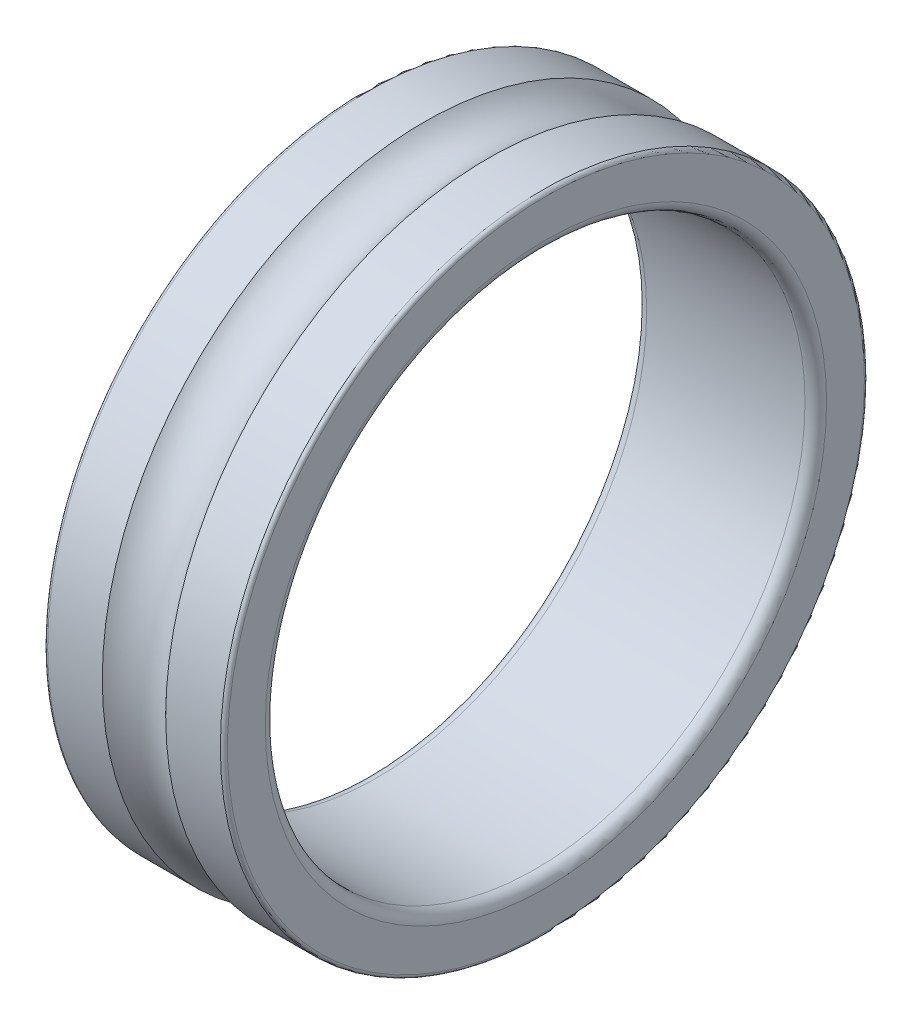
ISO-10303-21;
HEADER;
FILE_DESCRIPTION(('STEP AP214'),'2;1');
FILE_NAME('part.step','',(''),(''),'','','');
FILE_SCHEMA(('AUTOMOTIVE_DESIGN { 1 0 10303 214 1 1 1 1 }'));
ENDSEC;
DATA;
#1=APPLICATION_CONTEXT('core data for automotive mechanical design processes');
#2=APPLICATION_PROTOCOL_DEFINITION('international standard','automotive_design',2000,#1);
#3=PRODUCT_CONTEXT('',#1,'mechanical');
#4=PRODUCT('Part','Part','',(#3));
#5=PRODUCT_RELATED_PRODUCT_CATEGORY('part','',(#4));
#6=PRODUCT_DEFINITION_FORMATION('','',#4);
#7=PRODUCT_DEFINITION_CONTEXT('part definition',#1,'design');
#8=PRODUCT_DEFINITION('design','',#6,#7);
#9=PRODUCT_DEFINITION_SHAPE('','',#8);
#10=(LENGTH_UNIT() NAMED_UNIT(*) SI_UNIT(.MILLI.,.METRE.));
#11=(NAMED_UNIT(*) PLANE_ANGLE_UNIT() SI_UNIT($,.RADIAN.));
#12=(NAMED_UNIT(*) SI_UNIT($,.STERADIAN.) SOLID_ANGLE_UNIT());
#13=UNCERTAINTY_MEASURE_WITH_UNIT(LENGTH_MEASURE(1.E-05),#10,'distance_accuracy_value','');
#14=(GEOMETRIC_REPRESENTATION_CONTEXT(3) GLOBAL_UNCERTAINTY_ASSIGNED_CONTEXT((#13)) GLOBAL_UNIT_ASSIGNED_CONTEXT((#10,
#11,#12)) REPRESENTATION_CONTEXT('',''));
#15=CARTESIAN_POINT('',(0.,0.,0.));
#16=DIRECTION('',(0.,0.,1.));
#17=DIRECTION('',(1.,0.,0.));
#18=AXIS2_PLACEMENT_3D('',#15,#16,#17);
#19=CARTESIAN_POINT('',(0.299999999999941,0.,0.));
#20=DIRECTION('',(1.,0.,0.));
#21=DIRECTION('',(0.,0.,-1.));
#22=AXIS2_PLACEMENT_3D('',#19,#20,#21);
#23=TOROIDAL_SURFACE('',#22,7.79999999999994,0.299999999999941);
#24=CARTESIAN_POINT('',(0.3,0.,0.));
#25=DIRECTION('',(1.,0.,0.));
#26=DIRECTION('',(0.,0.,-1.));
#27=AXIS2_PLACEMENT_3D('',#24,#25,#26);
#28=CIRCLE('',#27,7.5);
#29=CARTESIAN_POINT('',(0.3,0.,-7.5));
#30=VERTEX_POINT('',#29);
#31=EDGE_CURVE('E10',#30,#30,#28,.T.);
#32=ORIENTED_EDGE('',*,*,#31,.T.);
#33=EDGE_LOOP('',(#32));
#34=FACE_BOUND('',#33,.T.);
#35=CARTESIAN_POINT('',(0.,0.,0.));
#36=DIRECTION('',(1.,0.,0.));
#37=DIRECTION('',(0.,0.,-1.));
#38=AXIS2_PLACEMENT_3D('',#35,#36,#37);
#39=CIRCLE('',#38,7.8);
#40=CARTESIAN_POINT('',(0.,0.,-7.8));
#41=VERTEX_POINT('',#40);
#42=EDGE_CURVE('E69',#41,#41,#39,.T.);
#43=ORIENTED_EDGE('',*,*,#42,.F.);
#44=EDGE_LOOP('',(#43));
#45=FACE_BOUND('',#44,.T.);
#46=ADVANCED_FACE('F35',(#34,#45),#23,.T.);
#47=CARTESIAN_POINT('',(4.7,0.,0.));
#48=DIRECTION('',(1.,0.,0.));
#49=DIRECTION('',(0.,0.,-1.));
#50=AXIS2_PLACEMENT_3D('',#47,#48,#49);
#51=CYLINDRICAL_SURFACE('',#50,7.5);
#52=CARTESIAN_POINT('',(4.7,0.,0.));
#53=DIRECTION('',(1.,0.,0.));
#54=DIRECTION('',(0.,0.,-1.));
#55=AXIS2_PLACEMENT_3D('',#52,#53,#54);
#56=CIRCLE('',#55,7.5);
#57=CARTESIAN_POINT('',(4.7,0.,-7.5));
#58=VERTEX_POINT('',#57);
#59=EDGE_CURVE('E41',#58,#58,#56,.T.);
#60=ORIENTED_EDGE('',*,*,#59,.T.);
#61=EDGE_LOOP('',(#60));
#62=FACE_BOUND('',#61,.T.);
#63=ORIENTED_EDGE('',*,*,#31,.F.);
#64=EDGE_LOOP('',(#63));
#65=FACE_BOUND('',#64,.T.);
#66=ADVANCED_FACE('F77',(#62,#65),#51,.F.);
#67=CARTESIAN_POINT('',(4.70000000000012,0.,0.));
#68=DIRECTION('',(1.,0.,0.));
#69=DIRECTION('',(0.,0.,-1.));
#70=AXIS2_PLACEMENT_3D('',#67,#68,#69);
#71=TOROIDAL_SURFACE('',#70,7.79999999999988,0.29999999999988);
#72=CARTESIAN_POINT('',(5.,0.,0.));
#73=DIRECTION('',(1.,0.,0.));
#74=DIRECTION('',(0.,0.,-1.));
#75=AXIS2_PLACEMENT_3D('',#72,#73,#74);
#76=CIRCLE('',#75,7.8);
#77=CARTESIAN_POINT('',(5.,0.,-7.8));
#78=VERTEX_POINT('',#77);
#79=EDGE_CURVE('E45',#78,#78,#76,.T.);
#80=ORIENTED_EDGE('',*,*,#79,.T.);
#81=EDGE_LOOP('',(#80));
#82=FACE_BOUND('',#81,.T.);
#83=ORIENTED_EDGE('',*,*,#59,.F.);
#84=EDGE_LOOP('',(#83));
#85=FACE_BOUND('',#84,.T.);
#86=ADVANCED_FACE('F81',(#82,#85),#71,.T.);
#87=CARTESIAN_POINT('',(5.,7.8,0.));
#88=DIRECTION('',(1.,0.,0.));
#89=DIRECTION('',(0.,0.,-1.));
#90=AXIS2_PLACEMENT_3D('',#87,#88,#89);
#91=PLANE('',#90);
#92=CARTESIAN_POINT('',(5.,0.,0.));
#93=DIRECTION('',(1.,0.,0.));
#94=DIRECTION('',(0.,0.,-1.));
#95=AXIS2_PLACEMENT_3D('',#92,#93,#94);
#96=CIRCLE('',#95,8.85);
#97=CARTESIAN_POINT('',(5.,0.,-8.85));
#98=VERTEX_POINT('',#97);
#99=EDGE_CURVE('E49',#98,#98,#96,.T.);
#100=ORIENTED_EDGE('',*,*,#99,.T.);
#101=EDGE_LOOP('',(#100));
#102=FACE_BOUND('',#101,.T.);
#103=ORIENTED_EDGE('',*,*,#79,.F.);
#104=EDGE_LOOP('',(#103));
#105=FACE_BOUND('',#104,.T.);
#106=ADVANCED_FACE('F85',(#102,#105),#91,.T.);
#107=CARTESIAN_POINT('',(4.90000000000015,0.,0.));
#108=DIRECTION('',(1.,0.,0.));
#109=DIRECTION('',(0.,0.,-1.));
#110=AXIS2_PLACEMENT_3D('',#107,#108,#109);
#111=TOROIDAL_SURFACE('',#110,8.85000000000015,0.099999999999845);
#112=CARTESIAN_POINT('',(4.9,0.,0.));
#113=DIRECTION('',(1.,0.,0.));
#114=DIRECTION('',(0.,0.,-1.));
#115=AXIS2_PLACEMENT_3D('',#112,#113,#114);
#116=CIRCLE('',#115,8.95);
#117=CARTESIAN_POINT('',(4.9,0.,-8.95));
#118=VERTEX_POINT('',#117);
#119=EDGE_CURVE('E54',#118,#118,#116,.T.);
#120=ORIENTED_EDGE('',*,*,#119,.T.);
#121=EDGE_LOOP('',(#120));
#122=FACE_BOUND('',#121,.T.);
#123=ORIENTED_EDGE('',*,*,#99,.F.);
#124=EDGE_LOOP('',(#123));
#125=FACE_BOUND('',#124,.T.);
#126=ADVANCED_FACE('F92',(#122,#125),#111,.T.);
#127=CARTESIAN_POINT('',(4.7,0.,0.));
#128=DIRECTION('',(1.,0.,0.));
#129=DIRECTION('',(0.,0.,-1.));
#130=AXIS2_PLACEMENT_3D('',#127,#128,#129);
#131=CYLINDRICAL_SURFACE('',#130,8.95);
#132=CARTESIAN_POINT('',(3.3816406580915,0.,0.));
#133=DIRECTION('',(1.,0.,0.));
#134=DIRECTION('',(0.,0.,-1.));
#135=AXIS2_PLACEMENT_3D('',#132,#133,#134);
#136=CIRCLE('',#135,8.95);
#137=CARTESIAN_POINT('',(3.3816406580915,0.,-8.95));
#138=VERTEX_POINT('',#137);
#139=EDGE_CURVE('E57',#138,#138,#136,.T.);
#140=ORIENTED_EDGE('',*,*,#139,.T.);
#141=EDGE_LOOP('',(#140));
#142=FACE_BOUND('',#141,.T.);
#143=ORIENTED_EDGE('',*,*,#119,.F.);
#144=EDGE_LOOP('',(#143));
#145=FACE_BOUND('',#144,.T.);
#146=ADVANCED_FACE('F96',(#142,#145),#131,.T.);
#147=CARTESIAN_POINT('',(2.5,0.,0.));
#148=DIRECTION('',(1.,0.,0.));
#149=DIRECTION('',(0.,0.,-1.));
#150=AXIS2_PLACEMENT_3D('',#147,#148,#149);
#151=TOROIDAL_SURFACE('',#150,9.75000000000002,1.19050000000002);
#152=CARTESIAN_POINT('',(1.6183593419085,0.,0.));
#153=DIRECTION('',(1.,0.,0.));
#154=DIRECTION('',(0.,0.,-1.));
#155=AXIS2_PLACEMENT_3D('',#152,#153,#154);
#156=CIRCLE('',#155,8.95);
#157=CARTESIAN_POINT('',(1.6183593419085,0.,-8.95));
#158=VERTEX_POINT('',#157);
#159=EDGE_CURVE('E60',#158,#158,#156,.T.);
#160=ORIENTED_EDGE('',*,*,#159,.T.);
#161=EDGE_LOOP('',(#160));
#162=FACE_BOUND('',#161,.T.);
#163=ORIENTED_EDGE('',*,*,#139,.F.);
#164=EDGE_LOOP('',(#163));
#165=FACE_BOUND('',#164,.T.);
#166=ADVANCED_FACE('F100',(#162,#165),#151,.F.);
#167=CARTESIAN_POINT('',(4.7,0.,0.));
#168=DIRECTION('',(1.,0.,0.));
#169=DIRECTION('',(0.,0.,-1.));
#170=AXIS2_PLACEMENT_3D('',#167,#168,#169);
#171=CYLINDRICAL_SURFACE('',#170,8.95);
#172=CARTESIAN_POINT('',(0.1,0.,0.));
#173=DIRECTION('',(1.,0.,0.));
#174=DIRECTION('',(0.,0.,-1.));
#175=AXIS2_PLACEMENT_3D('',#172,#173,#174);
#176=CIRCLE('',#175,8.95);
#177=CARTESIAN_POINT('',(0.1,0.,-8.95));
#178=VERTEX_POINT('',#177);
#179=EDGE_CURVE('E63',#178,#178,#176,.T.);
#180=ORIENTED_EDGE('',*,*,#179,.T.);
#181=EDGE_LOOP('',(#180));
#182=FACE_BOUND('',#181,.T.);
#183=ORIENTED_EDGE('',*,*,#159,.F.);
#184=EDGE_LOOP('',(#183));
#185=FACE_BOUND('',#184,.T.);
#186=ADVANCED_FACE('F104',(#182,#185),#171,.T.);
#187=CARTESIAN_POINT('',(0.0999999999999208,0.,0.));
#188=DIRECTION('',(1.,0.,0.));
#189=DIRECTION('',(0.,0.,-1.));
#190=AXIS2_PLACEMENT_3D('',#187,#188,#189);
#191=TOROIDAL_SURFACE('',#190,8.85000000000008,0.0999999999999211);
#192=CARTESIAN_POINT('',(0.,0.,0.));
#193=DIRECTION('',(1.,0.,0.));
#194=DIRECTION('',(0.,0.,-1.));
#195=AXIS2_PLACEMENT_3D('',#192,#193,#194);
#196=CIRCLE('',#195,8.85);
#197=CARTESIAN_POINT('',(0.,0.,-8.85));
#198=VERTEX_POINT('',#197);
#199=EDGE_CURVE('E66',#198,#198,#196,.T.);
#200=ORIENTED_EDGE('',*,*,#199,.T.);
#201=EDGE_LOOP('',(#200));
#202=FACE_BOUND('',#201,.T.);
#203=ORIENTED_EDGE('',*,*,#179,.F.);
#204=EDGE_LOOP('',(#203));
#205=FACE_BOUND('',#204,.T.);
#206=ADVANCED_FACE('F108',(#202,#205),#191,.T.);
#207=CARTESIAN_POINT('',(0.,8.85,0.));
#208=DIRECTION('',(-1.,0.,0.));
#209=DIRECTION('',(0.,0.,1.));
#210=AXIS2_PLACEMENT_3D('',#207,#208,#209);
#211=PLANE('',#210);
#212=ORIENTED_EDGE('',*,*,#42,.T.);
#213=EDGE_LOOP('',(#212));
#214=FACE_BOUND('',#213,.T.);
#215=ORIENTED_EDGE('',*,*,#199,.F.);
#216=EDGE_LOOP('',(#215));
#217=FACE_BOUND('',#216,.T.);
#218=ADVANCED_FACE('F73',(#214,#217),#211,.T.);
#219=CLOSED_SHELL('',(#46,#66,#86,#106,#126,#146,#166,#186,#206,#218));
#220=MANIFOLD_SOLID_BREP('B2',#219);
#221=ADVANCED_BREP_SHAPE_REPRESENTATION('',(#18,#220),#14);
#222=SHAPE_DEFINITION_REPRESENTATION(#9,#221);
ENDSEC;
END-ISO-10303-21;
